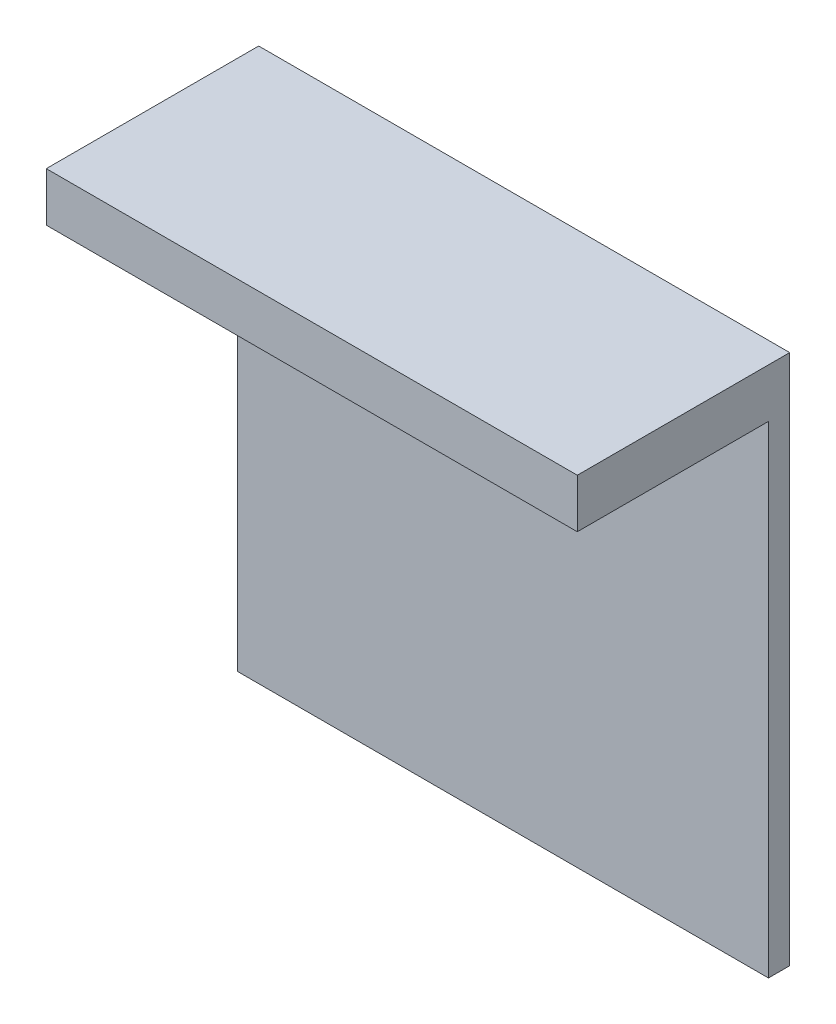
ISO-10303-21;
HEADER;
FILE_DESCRIPTION(('STEP AP214'),'2;1');
FILE_NAME('part.step','',(''),(''),'','','');
FILE_SCHEMA(('AUTOMOTIVE_DESIGN { 1 0 10303 214 1 1 1 1 }'));
ENDSEC;
DATA;
#1=APPLICATION_CONTEXT('core data for automotive mechanical design processes');
#2=APPLICATION_PROTOCOL_DEFINITION('international standard','automotive_design',2000,#1);
#3=PRODUCT_CONTEXT('',#1,'mechanical');
#4=PRODUCT('Part','Part','',(#3));
#5=PRODUCT_RELATED_PRODUCT_CATEGORY('part','',(#4));
#6=PRODUCT_DEFINITION_FORMATION('','',#4);
#7=PRODUCT_DEFINITION_CONTEXT('part definition',#1,'design');
#8=PRODUCT_DEFINITION('design','',#6,#7);
#9=PRODUCT_DEFINITION_SHAPE('','',#8);
#10=(LENGTH_UNIT() NAMED_UNIT(*) SI_UNIT(.MILLI.,.METRE.));
#11=(NAMED_UNIT(*) PLANE_ANGLE_UNIT() SI_UNIT($,.RADIAN.));
#12=(NAMED_UNIT(*) SI_UNIT($,.STERADIAN.) SOLID_ANGLE_UNIT());
#13=UNCERTAINTY_MEASURE_WITH_UNIT(LENGTH_MEASURE(1.E-05),#10,'distance_accuracy_value','');
#14=(GEOMETRIC_REPRESENTATION_CONTEXT(3) GLOBAL_UNCERTAINTY_ASSIGNED_CONTEXT((#13)) GLOBAL_UNIT_ASSIGNED_CONTEXT((#10,
#11,#12)) REPRESENTATION_CONTEXT('',''));
#15=CARTESIAN_POINT('',(0.,0.,0.));
#16=DIRECTION('',(0.,0.,1.));
#17=DIRECTION('',(1.,0.,0.));
#18=AXIS2_PLACEMENT_3D('',#15,#16,#17);
#19=CARTESIAN_POINT('',(250.,-500.,100.));
#20=DIRECTION('',(1.,0.,0.));
#21=DIRECTION('',(0.,0.,-1.));
#22=AXIS2_PLACEMENT_3D('',#19,#20,#21);
#23=PLANE('',#22);
#24=DIRECTION('',(0.,0.,1.));
#25=VECTOR('',#24,1.);
#26=CARTESIAN_POINT('',(250.,-46.1102354252013,-80.));
#27=LINE('',#26,#25);
#28=CARTESIAN_POINT('',(250.,-46.1102354252013,-80.));
#29=VERTEX_POINT('',#28);
#30=CARTESIAN_POINT('',(250.,-46.1102354252013,100.));
#31=VERTEX_POINT('',#30);
#32=EDGE_CURVE('E148',#29,#31,#27,.T.);
#33=ORIENTED_EDGE('',*,*,#32,.F.);
#34=DIRECTION('',(0.,1.,0.));
#35=VECTOR('',#34,1.);
#36=CARTESIAN_POINT('',(250.,-500.,-80.));
#37=LINE('',#36,#35);
#38=CARTESIAN_POINT('',(250.,-500.,-80.));
#39=VERTEX_POINT('',#38);
#40=EDGE_CURVE('E138',#39,#29,#37,.T.);
#41=ORIENTED_EDGE('',*,*,#40,.F.);
#42=DIRECTION('',(0.,0.,-1.));
#43=VECTOR('',#42,1.);
#44=CARTESIAN_POINT('',(250.,-500.,100.));
#45=LINE('',#44,#43);
#46=CARTESIAN_POINT('',(250.,-500.,-100.));
#47=VERTEX_POINT('',#46);
#48=EDGE_CURVE('E108',#39,#47,#45,.T.);
#49=ORIENTED_EDGE('',*,*,#48,.T.);
#50=DIRECTION('',(0.,1.,0.));
#51=VECTOR('',#50,1.);
#52=CARTESIAN_POINT('',(250.,-500.,-100.));
#53=LINE('',#52,#51);
#54=CARTESIAN_POINT('',(250.,0.,-100.));
#55=VERTEX_POINT('',#54);
#56=EDGE_CURVE('E42',#47,#55,#53,.T.);
#57=ORIENTED_EDGE('',*,*,#56,.T.);
#58=DIRECTION('',(0.,0.,-1.));
#59=VECTOR('',#58,1.);
#60=CARTESIAN_POINT('',(250.,0.,100.));
#61=LINE('',#60,#59);
#62=CARTESIAN_POINT('',(250.,0.,100.));
#63=VERTEX_POINT('',#62);
#64=EDGE_CURVE('E95',#63,#55,#61,.T.);
#65=ORIENTED_EDGE('',*,*,#64,.F.);
#66=DIRECTION('',(0.,1.,0.));
#67=VECTOR('',#66,1.);
#68=CARTESIAN_POINT('',(250.,-500.,100.));
#69=LINE('',#68,#67);
#70=EDGE_CURVE('E11',#31,#63,#69,.T.);
#71=ORIENTED_EDGE('',*,*,#70,.F.);
#72=EDGE_LOOP('',(#33,#41,#49,#57,#65,#71));
#73=FACE_BOUND('',#72,.T.);
#74=ADVANCED_FACE('F39',(#73),#23,.T.);
#75=CARTESIAN_POINT('',(-250.,-500.,100.));
#76=DIRECTION('',(0.,0.,1.));
#77=DIRECTION('',(1.,0.,0.));
#78=AXIS2_PLACEMENT_3D('',#75,#76,#77);
#79=PLANE('',#78);
#80=DIRECTION('',(-1.,0.,0.));
#81=VECTOR('',#80,1.);
#82=CARTESIAN_POINT('',(-250.,-46.1102354252013,100.));
#83=LINE('',#82,#81);
#84=CARTESIAN_POINT('',(-250.,-46.1102354252013,100.));
#85=VERTEX_POINT('',#84);
#86=EDGE_CURVE('E91',#31,#85,#83,.T.);
#87=ORIENTED_EDGE('',*,*,#86,.F.);
#88=ORIENTED_EDGE('',*,*,#70,.T.);
#89=DIRECTION('',(1.,0.,0.));
#90=VECTOR('',#89,1.);
#91=CARTESIAN_POINT('',(-250.,0.,100.));
#92=LINE('',#91,#90);
#93=CARTESIAN_POINT('',(-250.,0.,100.));
#94=VERTEX_POINT('',#93);
#95=EDGE_CURVE('E88',#94,#63,#92,.T.);
#96=ORIENTED_EDGE('',*,*,#95,.F.);
#97=DIRECTION('',(0.,1.,0.));
#98=VECTOR('',#97,1.);
#99=CARTESIAN_POINT('',(-250.,-500.,100.));
#100=LINE('',#99,#98);
#101=EDGE_CURVE('E48',#85,#94,#100,.T.);
#102=ORIENTED_EDGE('',*,*,#101,.F.);
#103=EDGE_LOOP('',(#87,#88,#96,#102));
#104=FACE_BOUND('',#103,.T.);
#105=ADVANCED_FACE('F85',(#104),#79,.T.);
#106=CARTESIAN_POINT('',(-250.,-500.,100.));
#107=DIRECTION('',(-1.,0.,0.));
#108=DIRECTION('',(0.,0.,1.));
#109=AXIS2_PLACEMENT_3D('',#106,#107,#108);
#110=PLANE('',#109);
#111=DIRECTION('',(0.,0.,1.));
#112=VECTOR('',#111,1.);
#113=CARTESIAN_POINT('',(-250.,-46.1102354252013,-80.));
#114=LINE('',#113,#112);
#115=CARTESIAN_POINT('',(-250.,-46.1102354252013,-80.));
#116=VERTEX_POINT('',#115);
#117=EDGE_CURVE('E102',#116,#85,#114,.T.);
#118=ORIENTED_EDGE('',*,*,#117,.T.);
#119=ORIENTED_EDGE('',*,*,#101,.T.);
#120=DIRECTION('',(0.,0.,1.));
#121=VECTOR('',#120,1.);
#122=CARTESIAN_POINT('',(-250.,0.,100.));
#123=LINE('',#122,#121);
#124=CARTESIAN_POINT('',(-250.,0.,-100.));
#125=VERTEX_POINT('',#124);
#126=EDGE_CURVE('E106',#125,#94,#123,.T.);
#127=ORIENTED_EDGE('',*,*,#126,.F.);
#128=DIRECTION('',(0.,1.,0.));
#129=VECTOR('',#128,1.);
#130=CARTESIAN_POINT('',(-250.,-500.,-100.));
#131=LINE('',#130,#129);
#132=CARTESIAN_POINT('',(-250.,-500.,-100.));
#133=VERTEX_POINT('',#132);
#134=EDGE_CURVE('E65',#133,#125,#131,.T.);
#135=ORIENTED_EDGE('',*,*,#134,.F.);
#136=DIRECTION('',(0.,0.,1.));
#137=VECTOR('',#136,1.);
#138=CARTESIAN_POINT('',(-250.,-500.,100.));
#139=LINE('',#138,#137);
#140=CARTESIAN_POINT('',(-250.,-500.,-80.));
#141=VERTEX_POINT('',#140);
#142=EDGE_CURVE('E122',#133,#141,#139,.T.);
#143=ORIENTED_EDGE('',*,*,#142,.T.);
#144=DIRECTION('',(0.,-1.,0.));
#145=VECTOR('',#144,1.);
#146=CARTESIAN_POINT('',(-250.,-500.,-80.));
#147=LINE('',#146,#145);
#148=EDGE_CURVE('E56',#116,#141,#147,.T.);
#149=ORIENTED_EDGE('',*,*,#148,.F.);
#150=EDGE_LOOP('',(#118,#119,#127,#135,#143,#149));
#151=FACE_BOUND('',#150,.T.);
#152=ADVANCED_FACE('F167',(#151),#110,.T.);
#153=CARTESIAN_POINT('',(-250.,-500.,-100.));
#154=DIRECTION('',(0.,0.,-1.));
#155=DIRECTION('',(-1.,0.,0.));
#156=AXIS2_PLACEMENT_3D('',#153,#154,#155);
#157=PLANE('',#156);
#158=DIRECTION('',(-1.,0.,0.));
#159=VECTOR('',#158,1.);
#160=CARTESIAN_POINT('',(-250.,0.,-100.));
#161=LINE('',#160,#159);
#162=EDGE_CURVE('E101',#55,#125,#161,.T.);
#163=ORIENTED_EDGE('',*,*,#162,.F.);
#164=ORIENTED_EDGE('',*,*,#56,.F.);
#165=DIRECTION('',(-1.,0.,0.));
#166=VECTOR('',#165,1.);
#167=CARTESIAN_POINT('',(-250.,-500.,-100.));
#168=LINE('',#167,#166);
#169=EDGE_CURVE('E112',#47,#133,#168,.T.);
#170=ORIENTED_EDGE('',*,*,#169,.T.);
#171=ORIENTED_EDGE('',*,*,#134,.T.);
#172=EDGE_LOOP('',(#163,#164,#170,#171));
#173=FACE_BOUND('',#172,.T.);
#174=ADVANCED_FACE('F128',(#173),#157,.T.);
#175=CARTESIAN_POINT('',(0.,-500.,0.));
#176=DIRECTION('',(0.,-1.,0.));
#177=DIRECTION('',(0.,0.,-1.));
#178=AXIS2_PLACEMENT_3D('',#175,#176,#177);
#179=PLANE('',#178);
#180=DIRECTION('',(1.,0.,0.));
#181=VECTOR('',#180,1.);
#182=CARTESIAN_POINT('',(-250.,-500.,-80.));
#183=LINE('',#182,#181);
#184=EDGE_CURVE('E134',#141,#39,#183,.T.);
#185=ORIENTED_EDGE('',*,*,#184,.F.);
#186=ORIENTED_EDGE('',*,*,#142,.F.);
#187=ORIENTED_EDGE('',*,*,#169,.F.);
#188=ORIENTED_EDGE('',*,*,#48,.F.);
#189=EDGE_LOOP('',(#185,#186,#187,#188));
#190=FACE_BOUND('',#189,.T.);
#191=ADVANCED_FACE('F132',(#190),#179,.T.);
#192=CARTESIAN_POINT('',(0.,0.,0.));
#193=DIRECTION('',(0.,-1.,0.));
#194=DIRECTION('',(0.,0.,-1.));
#195=AXIS2_PLACEMENT_3D('',#192,#193,#194);
#196=PLANE('',#195);
#197=ORIENTED_EDGE('',*,*,#64,.T.);
#198=ORIENTED_EDGE('',*,*,#162,.T.);
#199=ORIENTED_EDGE('',*,*,#126,.T.);
#200=ORIENTED_EDGE('',*,*,#95,.T.);
#201=EDGE_LOOP('',(#197,#198,#199,#200));
#202=FACE_BOUND('',#201,.T.);
#203=ADVANCED_FACE('F105',(#202),#196,.F.);
#204=CARTESIAN_POINT('',(-250.,-46.1102354252013,-80.));
#205=DIRECTION('',(0.,1.,0.));
#206=DIRECTION('',(0.,0.,1.));
#207=AXIS2_PLACEMENT_3D('',#204,#205,#206);
#208=PLANE('',#207);
#209=ORIENTED_EDGE('',*,*,#86,.T.);
#210=ORIENTED_EDGE('',*,*,#117,.F.);
#211=DIRECTION('',(-1.,0.,0.));
#212=VECTOR('',#211,1.);
#213=CARTESIAN_POINT('',(-250.,-46.1102354252013,-80.));
#214=LINE('',#213,#212);
#215=EDGE_CURVE('E142',#29,#116,#214,.T.);
#216=ORIENTED_EDGE('',*,*,#215,.F.);
#217=ORIENTED_EDGE('',*,*,#32,.T.);
#218=EDGE_LOOP('',(#209,#210,#216,#217));
#219=FACE_BOUND('',#218,.T.);
#220=ADVANCED_FACE('F158',(#219),#208,.F.);
#221=CARTESIAN_POINT('',(0.,0.,-80.));
#222=DIRECTION('',(0.,0.,-1.));
#223=DIRECTION('',(-1.,0.,0.));
#224=AXIS2_PLACEMENT_3D('',#221,#222,#223);
#225=PLANE('',#224);
#226=ORIENTED_EDGE('',*,*,#148,.T.);
#227=ORIENTED_EDGE('',*,*,#184,.T.);
#228=ORIENTED_EDGE('',*,*,#40,.T.);
#229=ORIENTED_EDGE('',*,*,#215,.T.);
#230=EDGE_LOOP('',(#226,#227,#228,#229));
#231=FACE_BOUND('',#230,.T.);
#232=ADVANCED_FACE('F166',(#231),#225,.F.);
#233=CLOSED_SHELL('',(#74,#105,#152,#174,#191,#203,#220,#232));
#234=MANIFOLD_SOLID_BREP('B2',#233);
#235=ADVANCED_BREP_SHAPE_REPRESENTATION('',(#18,#234),#14);
#236=SHAPE_DEFINITION_REPRESENTATION(#9,#235);
ENDSEC;
END-ISO-10303-21;
